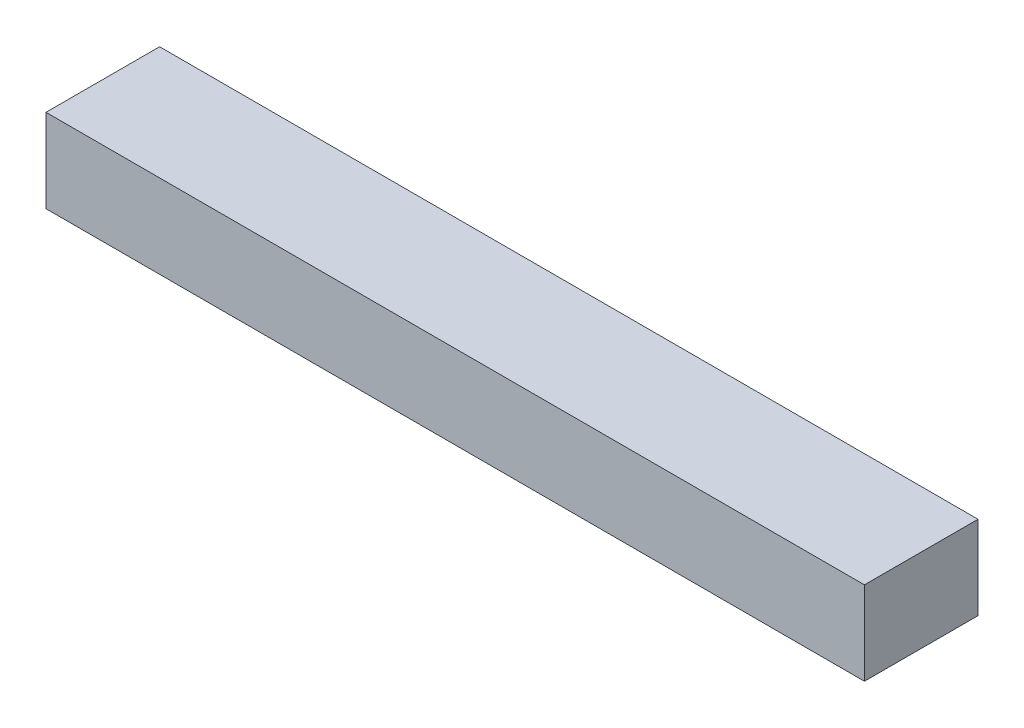
ISO-10303-21;
HEADER;
FILE_DESCRIPTION(('STEP AP214'),'2;1');
FILE_NAME('part.step','',(''),(''),'','','');
FILE_SCHEMA(('AUTOMOTIVE_DESIGN { 1 0 10303 214 1 1 1 1 }'));
ENDSEC;
DATA;
#1=APPLICATION_CONTEXT('core data for automotive mechanical design processes');
#2=APPLICATION_PROTOCOL_DEFINITION('international standard','automotive_design',2000,#1);
#3=PRODUCT_CONTEXT('',#1,'mechanical');
#4=PRODUCT('Part','Part','',(#3));
#5=PRODUCT_RELATED_PRODUCT_CATEGORY('part','',(#4));
#6=PRODUCT_DEFINITION_FORMATION('','',#4);
#7=PRODUCT_DEFINITION_CONTEXT('part definition',#1,'design');
#8=PRODUCT_DEFINITION('design','',#6,#7);
#9=PRODUCT_DEFINITION_SHAPE('','',#8);
#10=(LENGTH_UNIT() NAMED_UNIT(*) SI_UNIT(.MILLI.,.METRE.));
#11=(NAMED_UNIT(*) PLANE_ANGLE_UNIT() SI_UNIT($,.RADIAN.));
#12=(NAMED_UNIT(*) SI_UNIT($,.STERADIAN.) SOLID_ANGLE_UNIT());
#13=UNCERTAINTY_MEASURE_WITH_UNIT(LENGTH_MEASURE(1.E-05),#10,'distance_accuracy_value','');
#14=(GEOMETRIC_REPRESENTATION_CONTEXT(3) GLOBAL_UNCERTAINTY_ASSIGNED_CONTEXT((#13)) GLOBAL_UNIT_ASSIGNED_CONTEXT((#10,
#11,#12)) REPRESENTATION_CONTEXT('',''));
#15=CARTESIAN_POINT('',(0.,0.,0.));
#16=DIRECTION('',(0.,0.,1.));
#17=DIRECTION('',(1.,0.,0.));
#18=AXIS2_PLACEMENT_3D('',#15,#16,#17);
#19=CARTESIAN_POINT('',(-23.67677523401,5.,-6.51329243353783));
#20=DIRECTION('',(-1.,0.,0.));
#21=DIRECTION('',(0.,0.,1.));
#22=AXIS2_PLACEMENT_3D('',#19,#20,#21);
#23=PLANE('',#22);
#24=DIRECTION('',(0.,0.,-1.));
#25=VECTOR('',#24,1.);
#26=CARTESIAN_POINT('',(-23.67677523401,0.,-6.51329243353783));
#27=LINE('',#26,#25);
#28=CARTESIAN_POINT('',(-23.67677523401,0.,0.286707566462162));
#29=VERTEX_POINT('',#28);
#30=CARTESIAN_POINT('',(-23.67677523401,0.,-6.51329243353783));
#31=VERTEX_POINT('',#30);
#32=EDGE_CURVE('E95',#29,#31,#27,.T.);
#33=ORIENTED_EDGE('',*,*,#32,.T.);
#34=DIRECTION('',(0.,-1.,0.));
#35=VECTOR('',#34,1.);
#36=CARTESIAN_POINT('',(-23.67677523401,5.,-6.51329243353783));
#37=LINE('',#36,#35);
#38=CARTESIAN_POINT('',(-23.67677523401,5.,-6.51329243353783));
#39=VERTEX_POINT('',#38);
#40=EDGE_CURVE('E11',#39,#31,#37,.T.);
#41=ORIENTED_EDGE('',*,*,#40,.F.);
#42=DIRECTION('',(0.,0.,-1.));
#43=VECTOR('',#42,1.);
#44=CARTESIAN_POINT('',(-23.67677523401,5.,-6.51329243353783));
#45=LINE('',#44,#43);
#46=CARTESIAN_POINT('',(-23.67677523401,5.,0.286707566462162));
#47=VERTEX_POINT('',#46);
#48=EDGE_CURVE('E83',#47,#39,#45,.T.);
#49=ORIENTED_EDGE('',*,*,#48,.F.);
#50=DIRECTION('',(0.,-1.,0.));
#51=VECTOR('',#50,1.);
#52=CARTESIAN_POINT('',(-23.67677523401,5.,0.286707566462162));
#53=LINE('',#52,#51);
#54=EDGE_CURVE('E91',#47,#29,#53,.T.);
#55=ORIENTED_EDGE('',*,*,#54,.T.);
#56=EDGE_LOOP('',(#33,#41,#49,#55));
#57=FACE_BOUND('',#56,.T.);
#58=ADVANCED_FACE('F32',(#57),#23,.F.);
#59=CARTESIAN_POINT('',(-23.67677523401,5.,-6.51329243353783));
#60=DIRECTION('',(0.,0.,1.));
#61=DIRECTION('',(1.,0.,0.));
#62=AXIS2_PLACEMENT_3D('',#59,#60,#61);
#63=PLANE('',#62);
#64=DIRECTION('',(-1.,0.,0.));
#65=VECTOR('',#64,1.);
#66=CARTESIAN_POINT('',(-23.67677523401,0.,-6.51329243353783));
#67=LINE('',#66,#65);
#68=CARTESIAN_POINT('',(-72.67677523401,0.,-6.51329243353783));
#69=VERTEX_POINT('',#68);
#70=EDGE_CURVE('E87',#31,#69,#67,.T.);
#71=ORIENTED_EDGE('',*,*,#70,.T.);
#72=DIRECTION('',(0.,-1.,0.));
#73=VECTOR('',#72,1.);
#74=CARTESIAN_POINT('',(-72.67677523401,5.,-6.51329243353783));
#75=LINE('',#74,#73);
#76=CARTESIAN_POINT('',(-72.67677523401,5.,-6.51329243353783));
#77=VERTEX_POINT('',#76);
#78=EDGE_CURVE('E40',#77,#69,#75,.T.);
#79=ORIENTED_EDGE('',*,*,#78,.F.);
#80=DIRECTION('',(-1.,0.,0.));
#81=VECTOR('',#80,1.);
#82=CARTESIAN_POINT('',(-23.67677523401,5.,-6.51329243353783));
#83=LINE('',#82,#81);
#84=EDGE_CURVE('E78',#39,#77,#83,.T.);
#85=ORIENTED_EDGE('',*,*,#84,.F.);
#86=ORIENTED_EDGE('',*,*,#40,.T.);
#87=EDGE_LOOP('',(#71,#79,#85,#86));
#88=FACE_BOUND('',#87,.T.);
#89=ADVANCED_FACE('F86',(#88),#63,.F.);
#90=CARTESIAN_POINT('',(-72.67677523401,5.,-6.51329243353783));
#91=DIRECTION('',(1.,0.,0.));
#92=DIRECTION('',(0.,0.,-1.));
#93=AXIS2_PLACEMENT_3D('',#90,#91,#92);
#94=PLANE('',#93);
#95=DIRECTION('',(0.,0.,1.));
#96=VECTOR('',#95,1.);
#97=CARTESIAN_POINT('',(-72.67677523401,0.,-6.51329243353783));
#98=LINE('',#97,#96);
#99=CARTESIAN_POINT('',(-72.67677523401,0.,0.286707566462168));
#100=VERTEX_POINT('',#99);
#101=EDGE_CURVE('E65',#69,#100,#98,.T.);
#102=ORIENTED_EDGE('',*,*,#101,.T.);
#103=DIRECTION('',(0.,-1.,0.));
#104=VECTOR('',#103,1.);
#105=CARTESIAN_POINT('',(-72.67677523401,5.,0.286707566462168));
#106=LINE('',#105,#104);
#107=CARTESIAN_POINT('',(-72.67677523401,5.,0.286707566462168));
#108=VERTEX_POINT('',#107);
#109=EDGE_CURVE('E88',#108,#100,#106,.T.);
#110=ORIENTED_EDGE('',*,*,#109,.F.);
#111=DIRECTION('',(0.,0.,1.));
#112=VECTOR('',#111,1.);
#113=CARTESIAN_POINT('',(-72.67677523401,5.,-6.51329243353783));
#114=LINE('',#113,#112);
#115=EDGE_CURVE('E81',#77,#108,#114,.T.);
#116=ORIENTED_EDGE('',*,*,#115,.F.);
#117=ORIENTED_EDGE('',*,*,#78,.T.);
#118=EDGE_LOOP('',(#102,#110,#116,#117));
#119=FACE_BOUND('',#118,.T.);
#120=ADVANCED_FACE('F89',(#119),#94,.F.);
#121=CARTESIAN_POINT('',(-23.67677523401,5.,0.286707566462162));
#122=DIRECTION('',(0.,0.,-1.));
#123=DIRECTION('',(-1.,0.,0.));
#124=AXIS2_PLACEMENT_3D('',#121,#122,#123);
#125=PLANE('',#124);
#126=DIRECTION('',(1.,0.,0.));
#127=VECTOR('',#126,1.);
#128=CARTESIAN_POINT('',(-23.67677523401,0.,0.286707566462162));
#129=LINE('',#128,#127);
#130=EDGE_CURVE('E71',#100,#29,#129,.T.);
#131=ORIENTED_EDGE('',*,*,#130,.T.);
#132=ORIENTED_EDGE('',*,*,#54,.F.);
#133=DIRECTION('',(1.,0.,0.));
#134=VECTOR('',#133,1.);
#135=CARTESIAN_POINT('',(-23.67677523401,5.,0.286707566462162));
#136=LINE('',#135,#134);
#137=EDGE_CURVE('E48',#108,#47,#136,.T.);
#138=ORIENTED_EDGE('',*,*,#137,.F.);
#139=ORIENTED_EDGE('',*,*,#109,.T.);
#140=EDGE_LOOP('',(#131,#132,#138,#139));
#141=FACE_BOUND('',#140,.T.);
#142=ADVANCED_FACE('F102',(#141),#125,.F.);
#143=CARTESIAN_POINT('',(0.,5.,0.));
#144=DIRECTION('',(0.,-1.,0.));
#145=DIRECTION('',(0.,0.,-1.));
#146=AXIS2_PLACEMENT_3D('',#143,#144,#145);
#147=PLANE('',#146);
#148=ORIENTED_EDGE('',*,*,#48,.T.);
#149=ORIENTED_EDGE('',*,*,#84,.T.);
#150=ORIENTED_EDGE('',*,*,#115,.T.);
#151=ORIENTED_EDGE('',*,*,#137,.T.);
#152=EDGE_LOOP('',(#148,#149,#150,#151));
#153=FACE_BOUND('',#152,.T.);
#154=ADVANCED_FACE('F79',(#153),#147,.F.);
#155=CARTESIAN_POINT('',(0.,0.,0.));
#156=DIRECTION('',(0.,-1.,0.));
#157=DIRECTION('',(0.,0.,-1.));
#158=AXIS2_PLACEMENT_3D('',#155,#156,#157);
#159=PLANE('',#158);
#160=ORIENTED_EDGE('',*,*,#32,.F.);
#161=ORIENTED_EDGE('',*,*,#130,.F.);
#162=ORIENTED_EDGE('',*,*,#101,.F.);
#163=ORIENTED_EDGE('',*,*,#70,.F.);
#164=EDGE_LOOP('',(#160,#161,#162,#163));
#165=FACE_BOUND('',#164,.T.);
#166=ADVANCED_FACE('F105',(#165),#159,.T.);
#167=CLOSED_SHELL('',(#58,#89,#120,#142,#154,#166));
#168=MANIFOLD_SOLID_BREP('B2',#167);
#169=ADVANCED_BREP_SHAPE_REPRESENTATION('',(#18,#168),#14);
#170=SHAPE_DEFINITION_REPRESENTATION(#9,#169);
ENDSEC;
END-ISO-10303-21;
